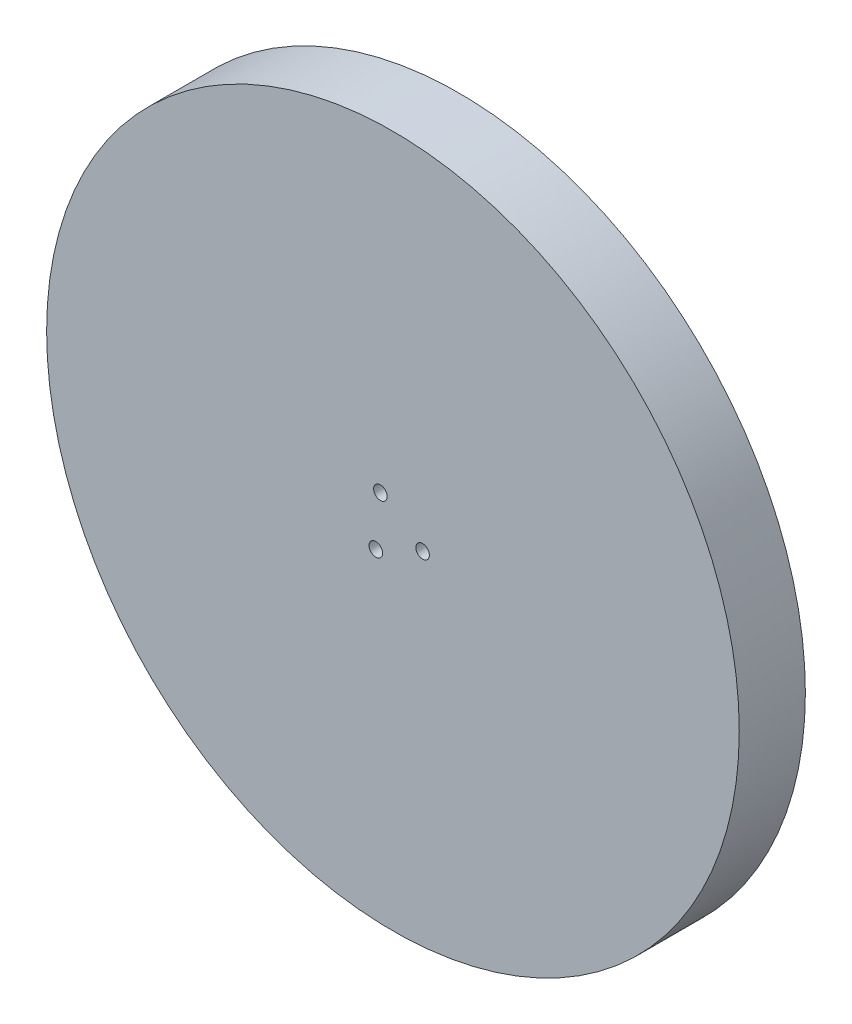
ISO-10303-21;
HEADER;
FILE_DESCRIPTION(('STEP AP214'),'2;1');
FILE_NAME('part.step','',(''),(''),'','','');
FILE_SCHEMA(('AUTOMOTIVE_DESIGN { 1 0 10303 214 1 1 1 1 }'));
ENDSEC;
DATA;
#1=APPLICATION_CONTEXT('core data for automotive mechanical design processes');
#2=APPLICATION_PROTOCOL_DEFINITION('international standard','automotive_design',2000,#1);
#3=PRODUCT_CONTEXT('',#1,'mechanical');
#4=PRODUCT('Part','Part','',(#3));
#5=PRODUCT_RELATED_PRODUCT_CATEGORY('part','',(#4));
#6=PRODUCT_DEFINITION_FORMATION('','',#4);
#7=PRODUCT_DEFINITION_CONTEXT('part definition',#1,'design');
#8=PRODUCT_DEFINITION('design','',#6,#7);
#9=PRODUCT_DEFINITION_SHAPE('','',#8);
#10=(LENGTH_UNIT() NAMED_UNIT(*) SI_UNIT(.MILLI.,.METRE.));
#11=(NAMED_UNIT(*) PLANE_ANGLE_UNIT() SI_UNIT($,.RADIAN.));
#12=(NAMED_UNIT(*) SI_UNIT($,.STERADIAN.) SOLID_ANGLE_UNIT());
#13=UNCERTAINTY_MEASURE_WITH_UNIT(LENGTH_MEASURE(1.E-05),#10,'distance_accuracy_value','');
#14=(GEOMETRIC_REPRESENTATION_CONTEXT(3) GLOBAL_UNCERTAINTY_ASSIGNED_CONTEXT((#13)) GLOBAL_UNIT_ASSIGNED_CONTEXT((#10,
#11,#12)) REPRESENTATION_CONTEXT('',''));
#15=CARTESIAN_POINT('',(0.,0.,0.));
#16=DIRECTION('',(0.,0.,1.));
#17=DIRECTION('',(1.,0.,0.));
#18=AXIS2_PLACEMENT_3D('',#15,#16,#17);
#19=CARTESIAN_POINT('',(0.,0.,10.));
#20=DIRECTION('',(0.,0.,-1.));
#21=DIRECTION('',(-1.,0.,0.));
#22=AXIS2_PLACEMENT_3D('',#19,#20,#21);
#23=CYLINDRICAL_SURFACE('',#22,52.3715255699422);
#24=CARTESIAN_POINT('',(0.,0.,10.));
#25=DIRECTION('',(0.,0.,1.));
#26=DIRECTION('',(1.,0.,0.));
#27=AXIS2_PLACEMENT_3D('',#24,#25,#26);
#28=CIRCLE('',#27,52.3715255699422);
#29=CARTESIAN_POINT('',(52.3715255699422,0.,10.));
#30=VERTEX_POINT('',#29);
#31=EDGE_CURVE('E10',#30,#30,#28,.T.);
#32=ORIENTED_EDGE('',*,*,#31,.F.);
#33=EDGE_LOOP('',(#32));
#34=FACE_BOUND('',#33,.T.);
#35=CARTESIAN_POINT('',(0.,0.,0.));
#36=DIRECTION('',(0.,0.,1.));
#37=DIRECTION('',(1.,0.,0.));
#38=AXIS2_PLACEMENT_3D('',#35,#36,#37);
#39=CIRCLE('',#38,52.3715255699422);
#40=CARTESIAN_POINT('',(52.3715255699422,0.,0.));
#41=VERTEX_POINT('',#40);
#42=EDGE_CURVE('E34',#41,#41,#39,.T.);
#43=ORIENTED_EDGE('',*,*,#42,.T.);
#44=EDGE_LOOP('',(#43));
#45=FACE_BOUND('',#44,.T.);
#46=ADVANCED_FACE('F31',(#34,#45),#23,.T.);
#47=CARTESIAN_POINT('',(0.,0.,10.));
#48=DIRECTION('',(0.,0.,1.));
#49=DIRECTION('',(1.,0.,0.));
#50=AXIS2_PLACEMENT_3D('',#47,#48,#49);
#51=PLANE('',#50);
#52=CARTESIAN_POINT('',(4.48196051050558,-0.402529479996111,9.99999999999999));
#53=DIRECTION('',(0.,0.,1.));
#54=DIRECTION('',(1.,0.,0.));
#55=AXIS2_PLACEMENT_3D('',#52,#53,#54);
#56=CIRCLE('',#55,1.02499999999998);
#57=CARTESIAN_POINT('',(5.50696051050557,-0.402529479996111,9.99999999999999));
#58=VERTEX_POINT('',#57);
#59=EDGE_CURVE('E54',#58,#58,#56,.T.);
#60=ORIENTED_EDGE('',*,*,#59,.F.);
#61=EDGE_LOOP('',(#60));
#62=FACE_BOUND('',#61,.T.);
#63=CARTESIAN_POINT('',(-2.58958101070234,-3.6802269208579,9.99999999999999));
#64=DIRECTION('',(0.,0.,1.));
#65=DIRECTION('',(1.,0.,0.));
#66=AXIS2_PLACEMENT_3D('',#63,#64,#65);
#67=CIRCLE('',#66,1.02499999999998);
#68=CARTESIAN_POINT('',(-1.56458101070235,-3.6802269208579,9.99999999999999));
#69=VERTEX_POINT('',#68);
#70=EDGE_CURVE('E48',#69,#69,#67,.T.);
#71=ORIENTED_EDGE('',*,*,#70,.F.);
#72=EDGE_LOOP('',(#71));
#73=FACE_BOUND('',#72,.T.);
#74=CARTESIAN_POINT('',(-1.89237949980395,4.08275640085554,9.99999999999999));
#75=DIRECTION('',(0.,0.,1.));
#76=DIRECTION('',(1.,0.,0.));
#77=AXIS2_PLACEMENT_3D('',#74,#75,#76);
#78=CIRCLE('',#77,1.02499999999998);
#79=CARTESIAN_POINT('',(-0.867379499803963,4.08275640085554,9.99999999999999));
#80=VERTEX_POINT('',#79);
#81=EDGE_CURVE('E41',#80,#80,#78,.T.);
#82=ORIENTED_EDGE('',*,*,#81,.F.);
#83=EDGE_LOOP('',(#82));
#84=FACE_BOUND('',#83,.T.);
#85=ORIENTED_EDGE('',*,*,#31,.T.);
#86=EDGE_LOOP('',(#85));
#87=FACE_BOUND('',#86,.T.);
#88=ADVANCED_FACE('F76',(#62,#73,#84,#87),#51,.T.);
#89=CARTESIAN_POINT('',(0.,0.,0.));
#90=DIRECTION('',(0.,0.,1.));
#91=DIRECTION('',(1.,0.,0.));
#92=AXIS2_PLACEMENT_3D('',#89,#90,#91);
#93=PLANE('',#92);
#94=CARTESIAN_POINT('',(4.48196051050558,-0.402529479996111,0.));
#95=DIRECTION('',(0.,0.,1.));
#96=DIRECTION('',(1.,0.,0.));
#97=AXIS2_PLACEMENT_3D('',#94,#95,#96);
#98=CIRCLE('',#97,1.02499999999998);
#99=CARTESIAN_POINT('',(5.50696051050556,-0.402529479996111,0.));
#100=VERTEX_POINT('',#99);
#101=EDGE_CURVE('E57',#100,#100,#98,.T.);
#102=ORIENTED_EDGE('',*,*,#101,.T.);
#103=EDGE_LOOP('',(#102));
#104=FACE_BOUND('',#103,.T.);
#105=CARTESIAN_POINT('',(-2.58958101070234,-3.6802269208579,0.));
#106=DIRECTION('',(0.,0.,1.));
#107=DIRECTION('',(1.,0.,0.));
#108=AXIS2_PLACEMENT_3D('',#105,#106,#107);
#109=CIRCLE('',#108,1.02499999999998);
#110=CARTESIAN_POINT('',(-1.56458101070236,-3.6802269208579,0.));
#111=VERTEX_POINT('',#110);
#112=EDGE_CURVE('E51',#111,#111,#109,.T.);
#113=ORIENTED_EDGE('',*,*,#112,.T.);
#114=EDGE_LOOP('',(#113));
#115=FACE_BOUND('',#114,.T.);
#116=CARTESIAN_POINT('',(-1.89237949980395,4.08275640085554,0.));
#117=DIRECTION('',(0.,0.,1.));
#118=DIRECTION('',(1.,0.,0.));
#119=AXIS2_PLACEMENT_3D('',#116,#117,#118);
#120=CIRCLE('',#119,1.02499999999998);
#121=CARTESIAN_POINT('',(-0.867379499803966,4.08275640085554,0.));
#122=VERTEX_POINT('',#121);
#123=EDGE_CURVE('E45',#122,#122,#120,.T.);
#124=ORIENTED_EDGE('',*,*,#123,.T.);
#125=EDGE_LOOP('',(#124));
#126=FACE_BOUND('',#125,.T.);
#127=ORIENTED_EDGE('',*,*,#42,.F.);
#128=EDGE_LOOP('',(#127));
#129=FACE_BOUND('',#128,.T.);
#130=ADVANCED_FACE('F61',(#104,#115,#126,#129),#93,.F.);
#131=CARTESIAN_POINT('',(-1.89237949980395,4.08275640085554,75.1531479604849));
#132=DIRECTION('',(0.,0.,1.));
#133=DIRECTION('',(1.,0.,0.));
#134=AXIS2_PLACEMENT_3D('',#131,#132,#133);
#135=CYLINDRICAL_SURFACE('',#134,1.02499999999998);
#136=ORIENTED_EDGE('',*,*,#81,.T.);
#137=EDGE_LOOP('',(#136));
#138=FACE_BOUND('',#137,.T.);
#139=ORIENTED_EDGE('',*,*,#123,.F.);
#140=EDGE_LOOP('',(#139));
#141=FACE_BOUND('',#140,.T.);
#142=ADVANCED_FACE('F72',(#138,#141),#135,.F.);
#143=CARTESIAN_POINT('',(-2.58958101070234,-3.6802269208579,75.1531479604849));
#144=DIRECTION('',(0.,0.,1.));
#145=DIRECTION('',(1.,0.,0.));
#146=AXIS2_PLACEMENT_3D('',#143,#144,#145);
#147=CYLINDRICAL_SURFACE('',#146,1.02499999999998);
#148=ORIENTED_EDGE('',*,*,#70,.T.);
#149=EDGE_LOOP('',(#148));
#150=FACE_BOUND('',#149,.T.);
#151=ORIENTED_EDGE('',*,*,#112,.F.);
#152=EDGE_LOOP('',(#151));
#153=FACE_BOUND('',#152,.T.);
#154=ADVANCED_FACE('F66',(#150,#153),#147,.F.);
#155=CARTESIAN_POINT('',(4.48196051050558,-0.402529479996111,75.1531479604849));
#156=DIRECTION('',(0.,0.,1.));
#157=DIRECTION('',(1.,0.,0.));
#158=AXIS2_PLACEMENT_3D('',#155,#156,#157);
#159=CYLINDRICAL_SURFACE('',#158,1.02499999999998);
#160=ORIENTED_EDGE('',*,*,#59,.T.);
#161=EDGE_LOOP('',(#160));
#162=FACE_BOUND('',#161,.T.);
#163=ORIENTED_EDGE('',*,*,#101,.F.);
#164=EDGE_LOOP('',(#163));
#165=FACE_BOUND('',#164,.T.);
#166=ADVANCED_FACE('F64',(#162,#165),#159,.F.);
#167=CLOSED_SHELL('',(#46,#88,#130,#142,#154,#166));
#168=MANIFOLD_SOLID_BREP('B2',#167);
#169=ADVANCED_BREP_SHAPE_REPRESENTATION('',(#18,#168),#14);
#170=SHAPE_DEFINITION_REPRESENTATION(#9,#169);
ENDSEC;
END-ISO-10303-21;
